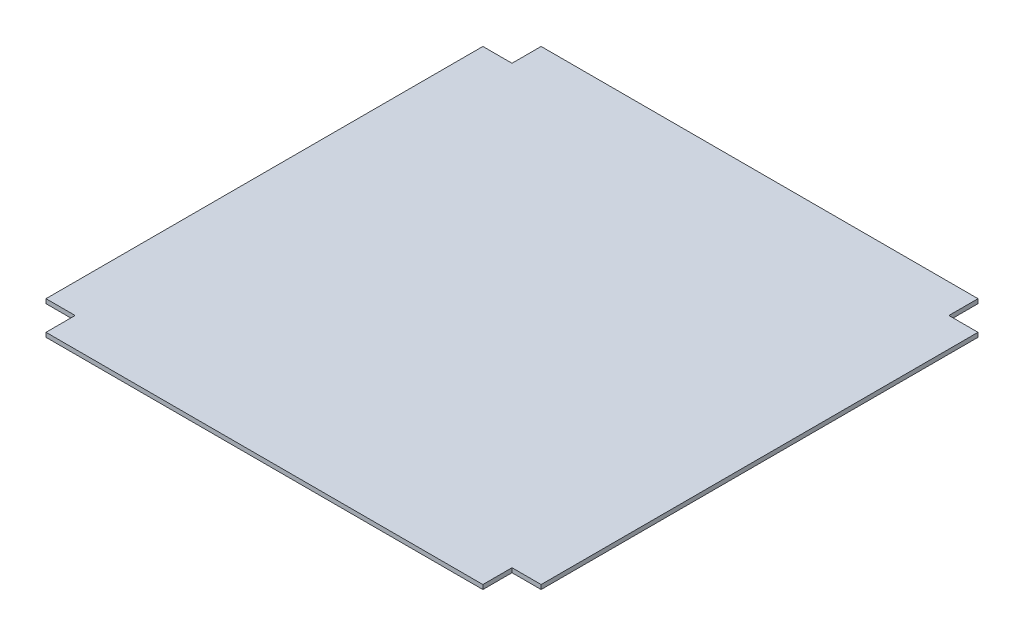
ISO-10303-21;
HEADER;
FILE_DESCRIPTION(('STEP AP214'),'2;1');
FILE_NAME('part.step','',(''),(''),'','','');
FILE_SCHEMA(('AUTOMOTIVE_DESIGN { 1 0 10303 214 1 1 1 1 }'));
ENDSEC;
DATA;
#1=APPLICATION_CONTEXT('core data for automotive mechanical design processes');
#2=APPLICATION_PROTOCOL_DEFINITION('international standard','automotive_design',2000,#1);
#3=PRODUCT_CONTEXT('',#1,'mechanical');
#4=PRODUCT('Part','Part','',(#3));
#5=PRODUCT_RELATED_PRODUCT_CATEGORY('part','',(#4));
#6=PRODUCT_DEFINITION_FORMATION('','',#4);
#7=PRODUCT_DEFINITION_CONTEXT('part definition',#1,'design');
#8=PRODUCT_DEFINITION('design','',#6,#7);
#9=PRODUCT_DEFINITION_SHAPE('','',#8);
#10=(LENGTH_UNIT() NAMED_UNIT(*) SI_UNIT(.MILLI.,.METRE.));
#11=(NAMED_UNIT(*) PLANE_ANGLE_UNIT() SI_UNIT($,.RADIAN.));
#12=(NAMED_UNIT(*) SI_UNIT($,.STERADIAN.) SOLID_ANGLE_UNIT());
#13=UNCERTAINTY_MEASURE_WITH_UNIT(LENGTH_MEASURE(1.E-05),#10,'distance_accuracy_value','');
#14=(GEOMETRIC_REPRESENTATION_CONTEXT(3) GLOBAL_UNCERTAINTY_ASSIGNED_CONTEXT((#13)) GLOBAL_UNIT_ASSIGNED_CONTEXT((#10,
#11,#12)) REPRESENTATION_CONTEXT('',''));
#15=CARTESIAN_POINT('',(0.,0.,0.));
#16=DIRECTION('',(0.,0.,1.));
#17=DIRECTION('',(1.,0.,0.));
#18=AXIS2_PLACEMENT_3D('',#15,#16,#17);
#19=CARTESIAN_POINT('',(0.,3.,0.));
#20=DIRECTION('',(-1.,0.,0.));
#21=DIRECTION('',(0.,0.,1.));
#22=AXIS2_PLACEMENT_3D('',#19,#20,#21);
#23=PLANE('',#22);
#24=DIRECTION('',(0.,0.,-1.));
#25=VECTOR('',#24,1.);
#26=CARTESIAN_POINT('',(0.,0.,0.));
#27=LINE('',#26,#25);
#28=CARTESIAN_POINT('',(0.,0.,-20.));
#29=VERTEX_POINT('',#28);
#30=CARTESIAN_POINT('',(0.,0.,-320.));
#31=VERTEX_POINT('',#30);
#32=EDGE_CURVE('E158',#29,#31,#27,.T.);
#33=ORIENTED_EDGE('',*,*,#32,.F.);
#34=DIRECTION('',(0.,-1.,0.));
#35=VECTOR('',#34,1.);
#36=CARTESIAN_POINT('',(0.,3.,-20.));
#37=LINE('',#36,#35);
#38=CARTESIAN_POINT('',(0.,3.,-20.));
#39=VERTEX_POINT('',#38);
#40=EDGE_CURVE('E11',#39,#29,#37,.T.);
#41=ORIENTED_EDGE('',*,*,#40,.F.);
#42=DIRECTION('',(0.,0.,-1.));
#43=VECTOR('',#42,1.);
#44=CARTESIAN_POINT('',(0.,3.,0.));
#45=LINE('',#44,#43);
#46=CARTESIAN_POINT('',(0.,3.,-320.));
#47=VERTEX_POINT('',#46);
#48=EDGE_CURVE('E188',#39,#47,#45,.T.);
#49=ORIENTED_EDGE('',*,*,#48,.T.);
#50=DIRECTION('',(0.,-1.,0.));
#51=VECTOR('',#50,1.);
#52=CARTESIAN_POINT('',(0.,3.,-320.));
#53=LINE('',#52,#51);
#54=EDGE_CURVE('E55',#47,#31,#53,.T.);
#55=ORIENTED_EDGE('',*,*,#54,.T.);
#56=EDGE_LOOP('',(#33,#41,#49,#55));
#57=FACE_BOUND('',#56,.T.);
#58=ADVANCED_FACE('F39',(#57),#23,.T.);
#59=CARTESIAN_POINT('',(0.,3.,-20.));
#60=DIRECTION('',(0.,0.,-1.));
#61=DIRECTION('',(-1.,0.,0.));
#62=AXIS2_PLACEMENT_3D('',#59,#60,#61);
#63=PLANE('',#62);
#64=DIRECTION('',(1.,0.,0.));
#65=VECTOR('',#64,1.);
#66=CARTESIAN_POINT('',(0.,0.,-20.));
#67=LINE('',#66,#65);
#68=CARTESIAN_POINT('',(20.,0.,-20.));
#69=VERTEX_POINT('',#68);
#70=EDGE_CURVE('E160',#29,#69,#67,.T.);
#71=ORIENTED_EDGE('',*,*,#70,.T.);
#72=DIRECTION('',(0.,-1.,0.));
#73=VECTOR('',#72,1.);
#74=CARTESIAN_POINT('',(20.,3.,-20.));
#75=LINE('',#74,#73);
#76=CARTESIAN_POINT('',(20.,3.,-20.));
#77=VERTEX_POINT('',#76);
#78=EDGE_CURVE('E47',#77,#69,#75,.T.);
#79=ORIENTED_EDGE('',*,*,#78,.F.);
#80=DIRECTION('',(1.,0.,0.));
#81=VECTOR('',#80,1.);
#82=CARTESIAN_POINT('',(0.,3.,-20.));
#83=LINE('',#82,#81);
#84=EDGE_CURVE('E369',#39,#77,#83,.T.);
#85=ORIENTED_EDGE('',*,*,#84,.F.);
#86=ORIENTED_EDGE('',*,*,#40,.T.);
#87=EDGE_LOOP('',(#71,#79,#85,#86));
#88=FACE_BOUND('',#87,.T.);
#89=ADVANCED_FACE('F214',(#88),#63,.F.);
#90=CARTESIAN_POINT('',(20.,3.,0.));
#91=DIRECTION('',(-1.,0.,0.));
#92=DIRECTION('',(0.,0.,1.));
#93=AXIS2_PLACEMENT_3D('',#90,#91,#92);
#94=PLANE('',#93);
#95=DIRECTION('',(0.,0.,-1.));
#96=VECTOR('',#95,1.);
#97=CARTESIAN_POINT('',(20.,0.,0.));
#98=LINE('',#97,#96);
#99=CARTESIAN_POINT('',(20.,0.,0.));
#100=VERTEX_POINT('',#99);
#101=EDGE_CURVE('E163',#100,#69,#98,.T.);
#102=ORIENTED_EDGE('',*,*,#101,.F.);
#103=DIRECTION('',(0.,-1.,0.));
#104=VECTOR('',#103,1.);
#105=CARTESIAN_POINT('',(20.,3.,0.));
#106=LINE('',#105,#104);
#107=CARTESIAN_POINT('',(20.,3.,0.));
#108=VERTEX_POINT('',#107);
#109=EDGE_CURVE('E204',#108,#100,#106,.T.);
#110=ORIENTED_EDGE('',*,*,#109,.F.);
#111=DIRECTION('',(0.,0.,-1.));
#112=VECTOR('',#111,1.);
#113=CARTESIAN_POINT('',(20.,3.,0.));
#114=LINE('',#113,#112);
#115=EDGE_CURVE('E211',#108,#77,#114,.T.);
#116=ORIENTED_EDGE('',*,*,#115,.T.);
#117=ORIENTED_EDGE('',*,*,#78,.T.);
#118=EDGE_LOOP('',(#102,#110,#116,#117));
#119=FACE_BOUND('',#118,.T.);
#120=ADVANCED_FACE('F209',(#119),#94,.T.);
#121=CARTESIAN_POINT('',(0.,3.,0.));
#122=DIRECTION('',(0.,0.,-1.));
#123=DIRECTION('',(-1.,0.,0.));
#124=AXIS2_PLACEMENT_3D('',#121,#122,#123);
#125=PLANE('',#124);
#126=DIRECTION('',(1.,0.,0.));
#127=VECTOR('',#126,1.);
#128=CARTESIAN_POINT('',(0.,0.,0.));
#129=LINE('',#128,#127);
#130=CARTESIAN_POINT('',(320.,0.,0.));
#131=VERTEX_POINT('',#130);
#132=EDGE_CURVE('E166',#100,#131,#129,.T.);
#133=ORIENTED_EDGE('',*,*,#132,.T.);
#134=DIRECTION('',(0.,-1.,0.));
#135=VECTOR('',#134,1.);
#136=CARTESIAN_POINT('',(320.,3.,0.));
#137=LINE('',#136,#135);
#138=CARTESIAN_POINT('',(320.,3.,0.));
#139=VERTEX_POINT('',#138);
#140=EDGE_CURVE('E201',#139,#131,#137,.T.);
#141=ORIENTED_EDGE('',*,*,#140,.F.);
#142=DIRECTION('',(1.,0.,0.));
#143=VECTOR('',#142,1.);
#144=CARTESIAN_POINT('',(0.,3.,0.));
#145=LINE('',#144,#143);
#146=EDGE_CURVE('E231',#108,#139,#145,.T.);
#147=ORIENTED_EDGE('',*,*,#146,.F.);
#148=ORIENTED_EDGE('',*,*,#109,.T.);
#149=EDGE_LOOP('',(#133,#141,#147,#148));
#150=FACE_BOUND('',#149,.T.);
#151=ADVANCED_FACE('F221',(#150),#125,.F.);
#152=CARTESIAN_POINT('',(320.,3.,0.));
#153=DIRECTION('',(-1.,0.,0.));
#154=DIRECTION('',(0.,0.,1.));
#155=AXIS2_PLACEMENT_3D('',#152,#153,#154);
#156=PLANE('',#155);
#157=DIRECTION('',(0.,0.,-1.));
#158=VECTOR('',#157,1.);
#159=CARTESIAN_POINT('',(320.,0.,0.));
#160=LINE('',#159,#158);
#161=CARTESIAN_POINT('',(320.,0.,-20.));
#162=VERTEX_POINT('',#161);
#163=EDGE_CURVE('E168',#131,#162,#160,.T.);
#164=ORIENTED_EDGE('',*,*,#163,.T.);
#165=DIRECTION('',(0.,-1.,0.));
#166=VECTOR('',#165,1.);
#167=CARTESIAN_POINT('',(320.,3.,-20.));
#168=LINE('',#167,#166);
#169=CARTESIAN_POINT('',(320.,3.,-20.));
#170=VERTEX_POINT('',#169);
#171=EDGE_CURVE('E199',#170,#162,#168,.T.);
#172=ORIENTED_EDGE('',*,*,#171,.F.);
#173=DIRECTION('',(0.,0.,-1.));
#174=VECTOR('',#173,1.);
#175=CARTESIAN_POINT('',(320.,3.,0.));
#176=LINE('',#175,#174);
#177=EDGE_CURVE('E227',#139,#170,#176,.T.);
#178=ORIENTED_EDGE('',*,*,#177,.F.);
#179=ORIENTED_EDGE('',*,*,#140,.T.);
#180=EDGE_LOOP('',(#164,#172,#178,#179));
#181=FACE_BOUND('',#180,.T.);
#182=ADVANCED_FACE('F225',(#181),#156,.F.);
#183=CARTESIAN_POINT('',(0.,3.,-20.0000000000008));
#184=DIRECTION('',(0.,0.,1.));
#185=DIRECTION('',(1.,0.,0.));
#186=AXIS2_PLACEMENT_3D('',#183,#184,#185);
#187=PLANE('',#186);
#188=DIRECTION('',(-1.,0.,0.));
#189=VECTOR('',#188,1.);
#190=CARTESIAN_POINT('',(0.,0.,-20.0000000000008));
#191=LINE('',#190,#189);
#192=CARTESIAN_POINT('',(340.,0.,-19.9999999999999));
#193=VERTEX_POINT('',#192);
#194=EDGE_CURVE('E171',#193,#162,#191,.T.);
#195=ORIENTED_EDGE('',*,*,#194,.F.);
#196=DIRECTION('',(0.,-1.,0.));
#197=VECTOR('',#196,1.);
#198=CARTESIAN_POINT('',(340.,3.,-19.9999999999999));
#199=LINE('',#198,#197);
#200=CARTESIAN_POINT('',(340.,3.,-19.9999999999999));
#201=VERTEX_POINT('',#200);
#202=EDGE_CURVE('E197',#201,#193,#199,.T.);
#203=ORIENTED_EDGE('',*,*,#202,.F.);
#204=DIRECTION('',(-1.,0.,0.));
#205=VECTOR('',#204,1.);
#206=CARTESIAN_POINT('',(0.,3.,-20.0000000000008));
#207=LINE('',#206,#205);
#208=EDGE_CURVE('E230',#201,#170,#207,.T.);
#209=ORIENTED_EDGE('',*,*,#208,.T.);
#210=ORIENTED_EDGE('',*,*,#171,.T.);
#211=EDGE_LOOP('',(#195,#203,#209,#210));
#212=FACE_BOUND('',#211,.T.);
#213=ADVANCED_FACE('F271',(#212),#187,.T.);
#214=CARTESIAN_POINT('',(340.,3.,0.));
#215=DIRECTION('',(-1.,0.,0.));
#216=DIRECTION('',(0.,0.,1.));
#217=AXIS2_PLACEMENT_3D('',#214,#215,#216);
#218=PLANE('',#217);
#219=DIRECTION('',(0.,0.,-1.));
#220=VECTOR('',#219,1.);
#221=CARTESIAN_POINT('',(340.,0.,0.));
#222=LINE('',#221,#220);
#223=CARTESIAN_POINT('',(340.,0.,-320.));
#224=VERTEX_POINT('',#223);
#225=EDGE_CURVE('E174',#193,#224,#222,.T.);
#226=ORIENTED_EDGE('',*,*,#225,.T.);
#227=DIRECTION('',(0.,-1.,0.));
#228=VECTOR('',#227,1.);
#229=CARTESIAN_POINT('',(340.,3.,-320.));
#230=LINE('',#229,#228);
#231=CARTESIAN_POINT('',(340.,3.,-320.));
#232=VERTEX_POINT('',#231);
#233=EDGE_CURVE('E194',#232,#224,#230,.T.);
#234=ORIENTED_EDGE('',*,*,#233,.F.);
#235=DIRECTION('',(0.,0.,-1.));
#236=VECTOR('',#235,1.);
#237=CARTESIAN_POINT('',(340.,3.,0.));
#238=LINE('',#237,#236);
#239=EDGE_CURVE('E233',#201,#232,#238,.T.);
#240=ORIENTED_EDGE('',*,*,#239,.F.);
#241=ORIENTED_EDGE('',*,*,#202,.T.);
#242=EDGE_LOOP('',(#226,#234,#240,#241));
#243=FACE_BOUND('',#242,.T.);
#244=ADVANCED_FACE('F274',(#243),#218,.F.);
#245=CARTESIAN_POINT('',(-8.88178419700122E-13,3.,-319.999999999999));
#246=DIRECTION('',(0.,0.,1.));
#247=DIRECTION('',(1.,0.,0.));
#248=AXIS2_PLACEMENT_3D('',#245,#246,#247);
#249=PLANE('',#248);
#250=DIRECTION('',(-1.,0.,0.));
#251=VECTOR('',#250,1.);
#252=CARTESIAN_POINT('',(-8.88178419700122E-13,0.,-319.999999999999));
#253=LINE('',#252,#251);
#254=CARTESIAN_POINT('',(320.,0.,-320.));
#255=VERTEX_POINT('',#254);
#256=EDGE_CURVE('E176',#224,#255,#253,.T.);
#257=ORIENTED_EDGE('',*,*,#256,.T.);
#258=DIRECTION('',(0.,-1.,0.));
#259=VECTOR('',#258,1.);
#260=CARTESIAN_POINT('',(320.,3.,-320.));
#261=LINE('',#260,#259);
#262=CARTESIAN_POINT('',(320.,3.,-320.));
#263=VERTEX_POINT('',#262);
#264=EDGE_CURVE('E192',#263,#255,#261,.T.);
#265=ORIENTED_EDGE('',*,*,#264,.F.);
#266=DIRECTION('',(-1.,0.,0.));
#267=VECTOR('',#266,1.);
#268=CARTESIAN_POINT('',(-8.88178419700122E-13,3.,-319.999999999999));
#269=LINE('',#268,#267);
#270=EDGE_CURVE('E153',#232,#263,#269,.T.);
#271=ORIENTED_EDGE('',*,*,#270,.F.);
#272=ORIENTED_EDGE('',*,*,#233,.T.);
#273=EDGE_LOOP('',(#257,#265,#271,#272));
#274=FACE_BOUND('',#273,.T.);
#275=ADVANCED_FACE('F243',(#274),#249,.F.);
#276=CARTESIAN_POINT('',(320.,3.,0.));
#277=DIRECTION('',(1.,0.,0.));
#278=DIRECTION('',(0.,0.,-1.));
#279=AXIS2_PLACEMENT_3D('',#276,#277,#278);
#280=PLANE('',#279);
#281=DIRECTION('',(0.,0.,1.));
#282=VECTOR('',#281,1.);
#283=CARTESIAN_POINT('',(320.,0.,0.));
#284=LINE('',#283,#282);
#285=CARTESIAN_POINT('',(320.,0.,-340.));
#286=VERTEX_POINT('',#285);
#287=EDGE_CURVE('E179',#286,#255,#284,.T.);
#288=ORIENTED_EDGE('',*,*,#287,.F.);
#289=DIRECTION('',(0.,-1.,0.));
#290=VECTOR('',#289,1.);
#291=CARTESIAN_POINT('',(320.,3.,-340.));
#292=LINE('',#291,#290);
#293=CARTESIAN_POINT('',(320.,3.,-340.));
#294=VERTEX_POINT('',#293);
#295=EDGE_CURVE('E139',#294,#286,#292,.T.);
#296=ORIENTED_EDGE('',*,*,#295,.F.);
#297=DIRECTION('',(0.,0.,1.));
#298=VECTOR('',#297,1.);
#299=CARTESIAN_POINT('',(320.,3.,0.));
#300=LINE('',#299,#298);
#301=EDGE_CURVE('E151',#294,#263,#300,.T.);
#302=ORIENTED_EDGE('',*,*,#301,.T.);
#303=ORIENTED_EDGE('',*,*,#264,.T.);
#304=EDGE_LOOP('',(#288,#296,#302,#303));
#305=FACE_BOUND('',#304,.T.);
#306=ADVANCED_FACE('F247',(#305),#280,.T.);
#307=CARTESIAN_POINT('',(0.,3.,-340.));
#308=DIRECTION('',(0.,0.,-1.));
#309=DIRECTION('',(-1.,0.,0.));
#310=AXIS2_PLACEMENT_3D('',#307,#308,#309);
#311=PLANE('',#310);
#312=DIRECTION('',(1.,0.,0.));
#313=VECTOR('',#312,1.);
#314=CARTESIAN_POINT('',(0.,0.,-340.));
#315=LINE('',#314,#313);
#316=CARTESIAN_POINT('',(20.,0.,-340.));
#317=VERTEX_POINT('',#316);
#318=EDGE_CURVE('E136',#317,#286,#315,.T.);
#319=ORIENTED_EDGE('',*,*,#318,.F.);
#320=DIRECTION('',(0.,-1.,0.));
#321=VECTOR('',#320,1.);
#322=CARTESIAN_POINT('',(20.,3.,-340.));
#323=LINE('',#322,#321);
#324=CARTESIAN_POINT('',(20.,3.,-340.));
#325=VERTEX_POINT('',#324);
#326=EDGE_CURVE('E130',#325,#317,#323,.T.);
#327=ORIENTED_EDGE('',*,*,#326,.F.);
#328=DIRECTION('',(1.,0.,0.));
#329=VECTOR('',#328,1.);
#330=CARTESIAN_POINT('',(0.,3.,-340.));
#331=LINE('',#330,#329);
#332=EDGE_CURVE('E134',#325,#294,#331,.T.);
#333=ORIENTED_EDGE('',*,*,#332,.T.);
#334=ORIENTED_EDGE('',*,*,#295,.T.);
#335=EDGE_LOOP('',(#319,#327,#333,#334));
#336=FACE_BOUND('',#335,.T.);
#337=ADVANCED_FACE('F132',(#336),#311,.T.);
#338=CARTESIAN_POINT('',(20.,3.,0.));
#339=DIRECTION('',(1.,0.,0.));
#340=DIRECTION('',(0.,0.,-1.));
#341=AXIS2_PLACEMENT_3D('',#338,#339,#340);
#342=PLANE('',#341);
#343=DIRECTION('',(0.,0.,1.));
#344=VECTOR('',#343,1.);
#345=CARTESIAN_POINT('',(20.,0.,0.));
#346=LINE('',#345,#344);
#347=CARTESIAN_POINT('',(20.,0.,-320.));
#348=VERTEX_POINT('',#347);
#349=EDGE_CURVE('E183',#317,#348,#346,.T.);
#350=ORIENTED_EDGE('',*,*,#349,.T.);
#351=DIRECTION('',(0.,-1.,0.));
#352=VECTOR('',#351,1.);
#353=CARTESIAN_POINT('',(20.,3.,-320.));
#354=LINE('',#353,#352);
#355=CARTESIAN_POINT('',(20.,3.,-320.));
#356=VERTEX_POINT('',#355);
#357=EDGE_CURVE('E93',#356,#348,#354,.T.);
#358=ORIENTED_EDGE('',*,*,#357,.F.);
#359=DIRECTION('',(0.,0.,1.));
#360=VECTOR('',#359,1.);
#361=CARTESIAN_POINT('',(20.,3.,0.));
#362=LINE('',#361,#360);
#363=EDGE_CURVE('E141',#325,#356,#362,.T.);
#364=ORIENTED_EDGE('',*,*,#363,.F.);
#365=ORIENTED_EDGE('',*,*,#326,.T.);
#366=EDGE_LOOP('',(#350,#358,#364,#365));
#367=FACE_BOUND('',#366,.T.);
#368=ADVANCED_FACE('F142',(#367),#342,.F.);
#369=CARTESIAN_POINT('',(0.,3.,-320.));
#370=DIRECTION('',(0.,0.,-1.));
#371=DIRECTION('',(-1.,0.,0.));
#372=AXIS2_PLACEMENT_3D('',#369,#370,#371);
#373=PLANE('',#372);
#374=DIRECTION('',(1.,0.,0.));
#375=VECTOR('',#374,1.);
#376=CARTESIAN_POINT('',(0.,0.,-320.));
#377=LINE('',#376,#375);
#378=EDGE_CURVE('E185',#31,#348,#377,.T.);
#379=ORIENTED_EDGE('',*,*,#378,.F.);
#380=ORIENTED_EDGE('',*,*,#54,.F.);
#381=DIRECTION('',(1.,0.,0.));
#382=VECTOR('',#381,1.);
#383=CARTESIAN_POINT('',(0.,3.,-320.));
#384=LINE('',#383,#382);
#385=EDGE_CURVE('E145',#47,#356,#384,.T.);
#386=ORIENTED_EDGE('',*,*,#385,.T.);
#387=ORIENTED_EDGE('',*,*,#357,.T.);
#388=EDGE_LOOP('',(#379,#380,#386,#387));
#389=FACE_BOUND('',#388,.T.);
#390=ADVANCED_FACE('F248',(#389),#373,.T.);
#391=CARTESIAN_POINT('',(0.,3.,0.));
#392=DIRECTION('',(0.,1.,0.));
#393=DIRECTION('',(0.,0.,1.));
#394=AXIS2_PLACEMENT_3D('',#391,#392,#393);
#395=PLANE('',#394);
#396=ORIENTED_EDGE('',*,*,#48,.F.);
#397=ORIENTED_EDGE('',*,*,#84,.T.);
#398=ORIENTED_EDGE('',*,*,#115,.F.);
#399=ORIENTED_EDGE('',*,*,#146,.T.);
#400=ORIENTED_EDGE('',*,*,#177,.T.);
#401=ORIENTED_EDGE('',*,*,#208,.F.);
#402=ORIENTED_EDGE('',*,*,#239,.T.);
#403=ORIENTED_EDGE('',*,*,#270,.T.);
#404=ORIENTED_EDGE('',*,*,#301,.F.);
#405=ORIENTED_EDGE('',*,*,#332,.F.);
#406=ORIENTED_EDGE('',*,*,#363,.T.);
#407=ORIENTED_EDGE('',*,*,#385,.F.);
#408=EDGE_LOOP('',(#396,#397,#398,#399,#400,#401,#402,#403,#404,#405,#406,#407));
#409=FACE_BOUND('',#408,.T.);
#410=ADVANCED_FACE('F149',(#409),#395,.T.);
#411=CARTESIAN_POINT('',(0.,0.,0.));
#412=DIRECTION('',(0.,1.,0.));
#413=DIRECTION('',(0.,0.,1.));
#414=AXIS2_PLACEMENT_3D('',#411,#412,#413);
#415=PLANE('',#414);
#416=ORIENTED_EDGE('',*,*,#32,.T.);
#417=ORIENTED_EDGE('',*,*,#378,.T.);
#418=ORIENTED_EDGE('',*,*,#349,.F.);
#419=ORIENTED_EDGE('',*,*,#318,.T.);
#420=ORIENTED_EDGE('',*,*,#287,.T.);
#421=ORIENTED_EDGE('',*,*,#256,.F.);
#422=ORIENTED_EDGE('',*,*,#225,.F.);
#423=ORIENTED_EDGE('',*,*,#194,.T.);
#424=ORIENTED_EDGE('',*,*,#163,.F.);
#425=ORIENTED_EDGE('',*,*,#132,.F.);
#426=ORIENTED_EDGE('',*,*,#101,.T.);
#427=ORIENTED_EDGE('',*,*,#70,.F.);
#428=EDGE_LOOP('',(#416,#417,#418,#419,#420,#421,#422,#423,#424,#425,#426,#427));
#429=FACE_BOUND('',#428,.T.);
#430=ADVANCED_FACE('F217',(#429),#415,.F.);
#431=CLOSED_SHELL('',(#58,#89,#120,#151,#182,#213,#244,#275,#306,#337,#368,#390,#410,#430));
#432=MANIFOLD_SOLID_BREP('B2',#431);
#433=ADVANCED_BREP_SHAPE_REPRESENTATION('',(#18,#432),#14);
#434=SHAPE_DEFINITION_REPRESENTATION(#9,#433);
ENDSEC;
END-ISO-10303-21;
